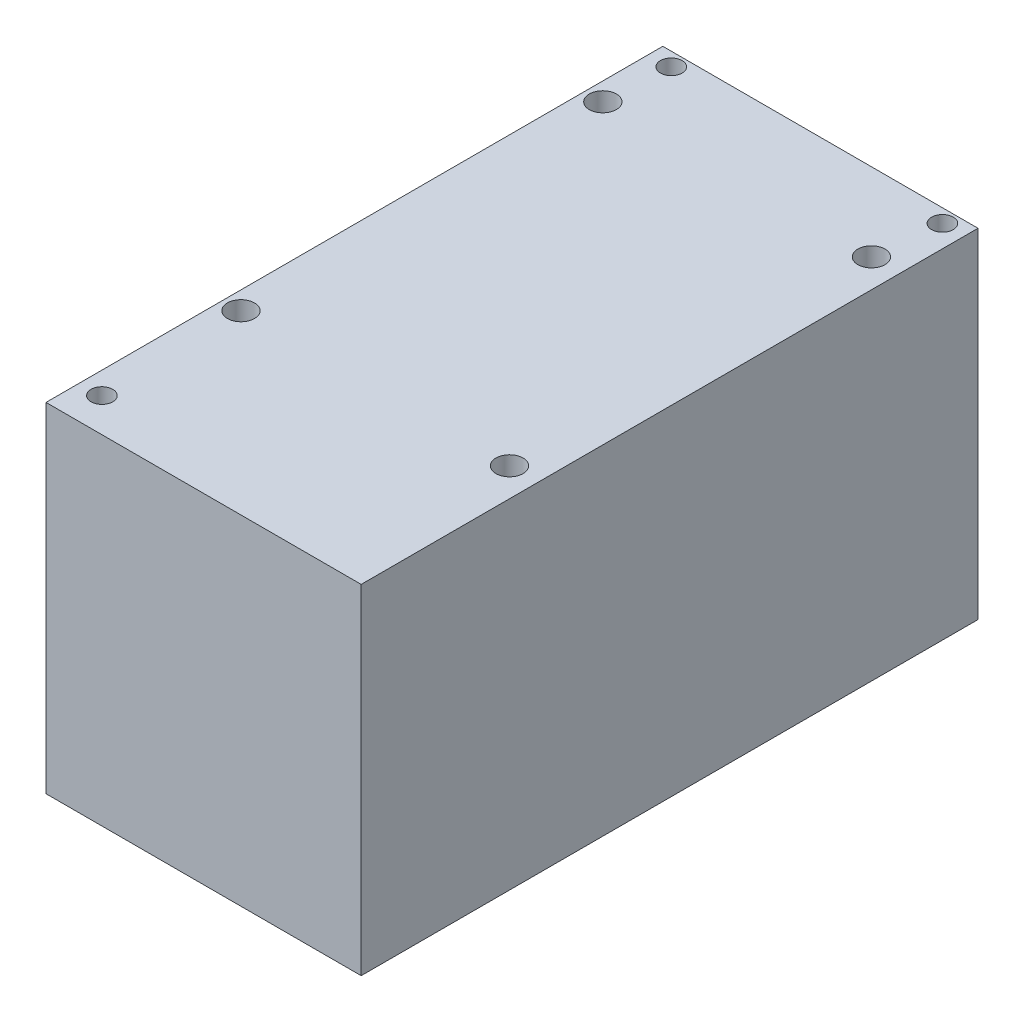
ISO-10303-21;
HEADER;
FILE_DESCRIPTION(('STEP AP214'),'2;1');
FILE_NAME('part.step','',(''),(''),'','','');
FILE_SCHEMA(('AUTOMOTIVE_DESIGN { 1 0 10303 214 1 1 1 1 }'));
ENDSEC;
DATA;
#1=APPLICATION_CONTEXT('core data for automotive mechanical design processes');
#2=APPLICATION_PROTOCOL_DEFINITION('international standard','automotive_design',2000,#1);
#3=PRODUCT_CONTEXT('',#1,'mechanical');
#4=PRODUCT('Part','Part','',(#3));
#5=PRODUCT_RELATED_PRODUCT_CATEGORY('part','',(#4));
#6=PRODUCT_DEFINITION_FORMATION('','',#4);
#7=PRODUCT_DEFINITION_CONTEXT('part definition',#1,'design');
#8=PRODUCT_DEFINITION('design','',#6,#7);
#9=PRODUCT_DEFINITION_SHAPE('','',#8);
#10=(LENGTH_UNIT() NAMED_UNIT(*) SI_UNIT(.MILLI.,.METRE.));
#11=(NAMED_UNIT(*) PLANE_ANGLE_UNIT() SI_UNIT($,.RADIAN.));
#12=(NAMED_UNIT(*) SI_UNIT($,.STERADIAN.) SOLID_ANGLE_UNIT());
#13=UNCERTAINTY_MEASURE_WITH_UNIT(LENGTH_MEASURE(1.E-05),#10,'distance_accuracy_value','');
#14=(GEOMETRIC_REPRESENTATION_CONTEXT(3) GLOBAL_UNCERTAINTY_ASSIGNED_CONTEXT((#13)) GLOBAL_UNIT_ASSIGNED_CONTEXT((#10,
#11,#12)) REPRESENTATION_CONTEXT('',''));
#15=CARTESIAN_POINT('',(0.,0.,0.));
#16=DIRECTION('',(0.,0.,1.));
#17=DIRECTION('',(1.,0.,0.));
#18=AXIS2_PLACEMENT_3D('',#15,#16,#17);
#19=CARTESIAN_POINT('',(0.,50.,0.));
#20=DIRECTION('',(0.,-1.,0.));
#21=DIRECTION('',(0.,0.,-1.));
#22=AXIS2_PLACEMENT_3D('',#19,#20,#21);
#23=PLANE('',#22);
#24=CARTESIAN_POINT('',(19.042,50.,-33.984));
#25=DIRECTION('',(0.,1.,0.));
#26=DIRECTION('',(0.,0.,1.));
#27=AXIS2_PLACEMENT_3D('',#24,#25,#26);
#28=CIRCLE('',#27,2.00000000000002);
#29=CARTESIAN_POINT('',(19.042,50.,-31.984));
#30=VERTEX_POINT('',#29);
#31=EDGE_CURVE('E133',#30,#30,#28,.T.);
#32=ORIENTED_EDGE('',*,*,#31,.F.);
#33=EDGE_LOOP('',(#32));
#34=FACE_BOUND('',#33,.T.);
#35=CARTESIAN_POINT('',(-20.583,50.,-33.984));
#36=DIRECTION('',(0.,1.,0.));
#37=DIRECTION('',(0.,0.,1.));
#38=AXIS2_PLACEMENT_3D('',#35,#36,#37);
#39=CIRCLE('',#38,2.00000000000002);
#40=CARTESIAN_POINT('',(-20.583,50.,-31.984));
#41=VERTEX_POINT('',#40);
#42=EDGE_CURVE('E122',#41,#41,#39,.T.);
#43=ORIENTED_EDGE('',*,*,#42,.F.);
#44=EDGE_LOOP('',(#43));
#45=FACE_BOUND('',#44,.T.);
#46=CARTESIAN_POINT('',(-20.583,50.,19.406));
#47=DIRECTION('',(0.,1.,0.));
#48=DIRECTION('',(0.,0.,1.));
#49=AXIS2_PLACEMENT_3D('',#46,#47,#48);
#50=CIRCLE('',#49,2.00000000000002);
#51=CARTESIAN_POINT('',(-20.583,50.,21.406));
#52=VERTEX_POINT('',#51);
#53=EDGE_CURVE('E121',#52,#52,#50,.T.);
#54=ORIENTED_EDGE('',*,*,#53,.F.);
#55=EDGE_LOOP('',(#54));
#56=FACE_BOUND('',#55,.T.);
#57=CARTESIAN_POINT('',(19.042,50.,19.406));
#58=DIRECTION('',(0.,1.,0.));
#59=DIRECTION('',(0.,0.,1.));
#60=AXIS2_PLACEMENT_3D('',#57,#58,#59);
#61=CIRCLE('',#60,2.00000000000001);
#62=CARTESIAN_POINT('',(19.042,50.,21.406));
#63=VERTEX_POINT('',#62);
#64=EDGE_CURVE('E138',#63,#63,#61,.T.);
#65=ORIENTED_EDGE('',*,*,#64,.F.);
#66=EDGE_LOOP('',(#65));
#67=FACE_BOUND('',#66,.T.);
#68=DIRECTION('',(0.,0.,-1.));
#69=VECTOR('',#68,1.);
#70=CARTESIAN_POINT('',(23.25,50.,45.5));
#71=LINE('',#70,#69);
#72=CARTESIAN_POINT('',(23.25,50.,45.5));
#73=VERTEX_POINT('',#72);
#74=CARTESIAN_POINT('',(23.25,50.,-45.5));
#75=VERTEX_POINT('',#74);
#76=EDGE_CURVE('E98',#73,#75,#71,.T.);
#77=ORIENTED_EDGE('',*,*,#76,.T.);
#78=DIRECTION('',(-1.,0.,0.));
#79=VECTOR('',#78,1.);
#80=CARTESIAN_POINT('',(-23.25,50.,-45.5));
#81=LINE('',#80,#79);
#82=CARTESIAN_POINT('',(-23.25,50.,-45.5));
#83=VERTEX_POINT('',#82);
#84=EDGE_CURVE('E93',#75,#83,#81,.T.);
#85=ORIENTED_EDGE('',*,*,#84,.T.);
#86=DIRECTION('',(0.,0.,1.));
#87=VECTOR('',#86,1.);
#88=CARTESIAN_POINT('',(-23.25,50.,45.5));
#89=LINE('',#88,#87);
#90=CARTESIAN_POINT('',(-23.25,50.,45.5));
#91=VERTEX_POINT('',#90);
#92=EDGE_CURVE('E96',#83,#91,#89,.T.);
#93=ORIENTED_EDGE('',*,*,#92,.T.);
#94=DIRECTION('',(1.,0.,0.));
#95=VECTOR('',#94,1.);
#96=CARTESIAN_POINT('',(-23.25,50.,45.5));
#97=LINE('',#96,#95);
#98=EDGE_CURVE('E63',#91,#73,#97,.T.);
#99=ORIENTED_EDGE('',*,*,#98,.T.);
#100=EDGE_LOOP('',(#77,#85,#93,#99));
#101=FACE_BOUND('',#100,.T.);
#102=CARTESIAN_POINT('',(20.,50.,-43.5));
#103=DIRECTION('',(0.,1.,0.));
#104=DIRECTION('',(0.,0.,1.));
#105=AXIS2_PLACEMENT_3D('',#102,#103,#104);
#106=CIRCLE('',#105,1.6);
#107=CARTESIAN_POINT('',(20.,50.,-41.9));
#108=VERTEX_POINT('',#107);
#109=EDGE_CURVE('E114',#108,#108,#106,.T.);
#110=ORIENTED_EDGE('',*,*,#109,.F.);
#111=EDGE_LOOP('',(#110));
#112=FACE_BOUND('',#111,.T.);
#113=CARTESIAN_POINT('',(-20.,50.,-43.5));
#114=DIRECTION('',(0.,1.,0.));
#115=DIRECTION('',(0.,0.,-1.));
#116=AXIS2_PLACEMENT_3D('',#113,#114,#115);
#117=CIRCLE('',#116,1.6);
#118=CARTESIAN_POINT('',(-20.,50.,-45.1));
#119=VERTEX_POINT('',#118);
#120=EDGE_CURVE('E151',#119,#119,#117,.T.);
#121=ORIENTED_EDGE('',*,*,#120,.F.);
#122=EDGE_LOOP('',(#121));
#123=FACE_BOUND('',#122,.T.);
#124=CARTESIAN_POINT('',(-20.,50.,40.5));
#125=DIRECTION('',(0.,1.,0.));
#126=DIRECTION('',(0.,0.,1.));
#127=AXIS2_PLACEMENT_3D('',#124,#125,#126);
#128=CIRCLE('',#127,1.6);
#129=CARTESIAN_POINT('',(-20.,50.,42.1));
#130=VERTEX_POINT('',#129);
#131=EDGE_CURVE('E145',#130,#130,#128,.T.);
#132=ORIENTED_EDGE('',*,*,#131,.F.);
#133=EDGE_LOOP('',(#132));
#134=FACE_BOUND('',#133,.T.);
#135=ADVANCED_FACE('F44',(#34,#45,#56,#67,#101,#112,#123,#134),#23,.F.);
#136=CARTESIAN_POINT('',(0.,0.,0.));
#137=DIRECTION('',(0.,-1.,0.));
#138=DIRECTION('',(0.,0.,-1.));
#139=AXIS2_PLACEMENT_3D('',#136,#137,#138);
#140=PLANE('',#139);
#141=CARTESIAN_POINT('',(19.042,0.,-33.984));
#142=DIRECTION('',(0.,-1.,0.));
#143=DIRECTION('',(0.,0.,-1.));
#144=AXIS2_PLACEMENT_3D('',#141,#142,#143);
#145=CIRCLE('',#144,2.00000000000001);
#146=CARTESIAN_POINT('',(19.042,0.,-35.984));
#147=VERTEX_POINT('',#146);
#148=EDGE_CURVE('E48',#147,#147,#145,.T.);
#149=ORIENTED_EDGE('',*,*,#148,.F.);
#150=EDGE_LOOP('',(#149));
#151=FACE_BOUND('',#150,.T.);
#152=CARTESIAN_POINT('',(-20.583,0.,-33.984));
#153=DIRECTION('',(0.,-1.,0.));
#154=DIRECTION('',(0.,0.,-1.));
#155=AXIS2_PLACEMENT_3D('',#152,#153,#154);
#156=CIRCLE('',#155,2.00000000000001);
#157=CARTESIAN_POINT('',(-20.583,0.,-35.984));
#158=VERTEX_POINT('',#157);
#159=EDGE_CURVE('E119',#158,#158,#156,.T.);
#160=ORIENTED_EDGE('',*,*,#159,.F.);
#161=EDGE_LOOP('',(#160));
#162=FACE_BOUND('',#161,.T.);
#163=CARTESIAN_POINT('',(-20.583,0.,19.406));
#164=DIRECTION('',(0.,-1.,0.));
#165=DIRECTION('',(0.,0.,-1.));
#166=AXIS2_PLACEMENT_3D('',#163,#164,#165);
#167=CIRCLE('',#166,2.00000000000001);
#168=CARTESIAN_POINT('',(-20.583,0.,17.406));
#169=VERTEX_POINT('',#168);
#170=EDGE_CURVE('E126',#169,#169,#167,.T.);
#171=ORIENTED_EDGE('',*,*,#170,.F.);
#172=EDGE_LOOP('',(#171));
#173=FACE_BOUND('',#172,.T.);
#174=CARTESIAN_POINT('',(19.042,0.,19.406));
#175=DIRECTION('',(0.,1.,0.));
#176=DIRECTION('',(0.,0.,1.));
#177=AXIS2_PLACEMENT_3D('',#174,#175,#176);
#178=CIRCLE('',#177,2.00000000000001);
#179=CARTESIAN_POINT('',(19.042,0.,21.406));
#180=VERTEX_POINT('',#179);
#181=EDGE_CURVE('E141',#180,#180,#178,.T.);
#182=ORIENTED_EDGE('',*,*,#181,.T.);
#183=EDGE_LOOP('',(#182));
#184=FACE_BOUND('',#183,.T.);
#185=CARTESIAN_POINT('',(-20.,0.,-43.5));
#186=DIRECTION('',(0.,1.,0.));
#187=DIRECTION('',(0.,0.,-1.));
#188=AXIS2_PLACEMENT_3D('',#185,#186,#187);
#189=CIRCLE('',#188,1.6);
#190=CARTESIAN_POINT('',(-20.,0.,-45.1));
#191=VERTEX_POINT('',#190);
#192=EDGE_CURVE('E148',#191,#191,#189,.T.);
#193=ORIENTED_EDGE('',*,*,#192,.T.);
#194=EDGE_LOOP('',(#193));
#195=FACE_BOUND('',#194,.T.);
#196=DIRECTION('',(0.,0.,-1.));
#197=VECTOR('',#196,1.);
#198=CARTESIAN_POINT('',(23.25,0.,45.5));
#199=LINE('',#198,#197);
#200=CARTESIAN_POINT('',(23.25,0.,45.5));
#201=VERTEX_POINT('',#200);
#202=CARTESIAN_POINT('',(23.25,0.,-45.5));
#203=VERTEX_POINT('',#202);
#204=EDGE_CURVE('E111',#201,#203,#199,.T.);
#205=ORIENTED_EDGE('',*,*,#204,.F.);
#206=DIRECTION('',(1.,0.,0.));
#207=VECTOR('',#206,1.);
#208=CARTESIAN_POINT('',(-23.25,0.,45.5));
#209=LINE('',#208,#207);
#210=CARTESIAN_POINT('',(-23.25,0.,45.5));
#211=VERTEX_POINT('',#210);
#212=EDGE_CURVE('E86',#211,#201,#209,.T.);
#213=ORIENTED_EDGE('',*,*,#212,.F.);
#214=DIRECTION('',(0.,0.,1.));
#215=VECTOR('',#214,1.);
#216=CARTESIAN_POINT('',(-23.25,0.,45.5));
#217=LINE('',#216,#215);
#218=CARTESIAN_POINT('',(-23.25,0.,-45.5));
#219=VERTEX_POINT('',#218);
#220=EDGE_CURVE('E80',#219,#211,#217,.T.);
#221=ORIENTED_EDGE('',*,*,#220,.F.);
#222=DIRECTION('',(-1.,0.,0.));
#223=VECTOR('',#222,1.);
#224=CARTESIAN_POINT('',(-23.25,0.,-45.5));
#225=LINE('',#224,#223);
#226=EDGE_CURVE('E102',#203,#219,#225,.T.);
#227=ORIENTED_EDGE('',*,*,#226,.F.);
#228=EDGE_LOOP('',(#205,#213,#221,#227));
#229=FACE_BOUND('',#228,.T.);
#230=CARTESIAN_POINT('',(20.,0.,-43.5));
#231=DIRECTION('',(0.,1.,0.));
#232=DIRECTION('',(0.,0.,1.));
#233=AXIS2_PLACEMENT_3D('',#230,#231,#232);
#234=CIRCLE('',#233,1.6);
#235=CARTESIAN_POINT('',(20.,0.,-41.9));
#236=VERTEX_POINT('',#235);
#237=EDGE_CURVE('E154',#236,#236,#234,.T.);
#238=ORIENTED_EDGE('',*,*,#237,.T.);
#239=EDGE_LOOP('',(#238));
#240=FACE_BOUND('',#239,.T.);
#241=CARTESIAN_POINT('',(-20.,0.,40.5));
#242=DIRECTION('',(0.,1.,0.));
#243=DIRECTION('',(0.,0.,1.));
#244=AXIS2_PLACEMENT_3D('',#241,#242,#243);
#245=CIRCLE('',#244,1.6);
#246=CARTESIAN_POINT('',(-20.,0.,42.1));
#247=VERTEX_POINT('',#246);
#248=EDGE_CURVE('E144',#247,#247,#245,.T.);
#249=ORIENTED_EDGE('',*,*,#248,.T.);
#250=EDGE_LOOP('',(#249));
#251=FACE_BOUND('',#250,.T.);
#252=ADVANCED_FACE('F162',(#151,#162,#173,#184,#195,#229,#240,#251),#140,.T.);
#253=CARTESIAN_POINT('',(23.25,50.,45.5));
#254=DIRECTION('',(-1.,0.,0.));
#255=DIRECTION('',(0.,0.,1.));
#256=AXIS2_PLACEMENT_3D('',#253,#254,#255);
#257=PLANE('',#256);
#258=ORIENTED_EDGE('',*,*,#204,.T.);
#259=DIRECTION('',(0.,-1.,0.));
#260=VECTOR('',#259,1.);
#261=CARTESIAN_POINT('',(23.25,50.,-45.5));
#262=LINE('',#261,#260);
#263=EDGE_CURVE('E11',#75,#203,#262,.T.);
#264=ORIENTED_EDGE('',*,*,#263,.F.);
#265=ORIENTED_EDGE('',*,*,#76,.F.);
#266=DIRECTION('',(0.,-1.,0.));
#267=VECTOR('',#266,1.);
#268=CARTESIAN_POINT('',(23.25,50.,45.5));
#269=LINE('',#268,#267);
#270=EDGE_CURVE('E107',#73,#201,#269,.T.);
#271=ORIENTED_EDGE('',*,*,#270,.T.);
#272=EDGE_LOOP('',(#258,#264,#265,#271));
#273=FACE_BOUND('',#272,.T.);
#274=ADVANCED_FACE('F46',(#273),#257,.F.);
#275=CARTESIAN_POINT('',(-23.25,50.,-45.5));
#276=DIRECTION('',(0.,0.,1.));
#277=DIRECTION('',(1.,0.,0.));
#278=AXIS2_PLACEMENT_3D('',#275,#276,#277);
#279=PLANE('',#278);
#280=ORIENTED_EDGE('',*,*,#226,.T.);
#281=DIRECTION('',(0.,-1.,0.));
#282=VECTOR('',#281,1.);
#283=CARTESIAN_POINT('',(-23.25,50.,-45.5));
#284=LINE('',#283,#282);
#285=EDGE_CURVE('E54',#83,#219,#284,.T.);
#286=ORIENTED_EDGE('',*,*,#285,.F.);
#287=ORIENTED_EDGE('',*,*,#84,.F.);
#288=ORIENTED_EDGE('',*,*,#263,.T.);
#289=EDGE_LOOP('',(#280,#286,#287,#288));
#290=FACE_BOUND('',#289,.T.);
#291=ADVANCED_FACE('F101',(#290),#279,.F.);
#292=CARTESIAN_POINT('',(-23.25,50.,45.5));
#293=DIRECTION('',(1.,0.,0.));
#294=DIRECTION('',(0.,0.,-1.));
#295=AXIS2_PLACEMENT_3D('',#292,#293,#294);
#296=PLANE('',#295);
#297=ORIENTED_EDGE('',*,*,#220,.T.);
#298=DIRECTION('',(0.,-1.,0.));
#299=VECTOR('',#298,1.);
#300=CARTESIAN_POINT('',(-23.25,50.,45.5));
#301=LINE('',#300,#299);
#302=EDGE_CURVE('E103',#91,#211,#301,.T.);
#303=ORIENTED_EDGE('',*,*,#302,.F.);
#304=ORIENTED_EDGE('',*,*,#92,.F.);
#305=ORIENTED_EDGE('',*,*,#285,.T.);
#306=EDGE_LOOP('',(#297,#303,#304,#305));
#307=FACE_BOUND('',#306,.T.);
#308=ADVANCED_FACE('F105',(#307),#296,.F.);
#309=CARTESIAN_POINT('',(-23.25,50.,45.5));
#310=DIRECTION('',(0.,0.,-1.));
#311=DIRECTION('',(-1.,0.,0.));
#312=AXIS2_PLACEMENT_3D('',#309,#310,#311);
#313=PLANE('',#312);
#314=ORIENTED_EDGE('',*,*,#212,.T.);
#315=ORIENTED_EDGE('',*,*,#270,.F.);
#316=ORIENTED_EDGE('',*,*,#98,.F.);
#317=ORIENTED_EDGE('',*,*,#302,.T.);
#318=EDGE_LOOP('',(#314,#315,#316,#317));
#319=FACE_BOUND('',#318,.T.);
#320=ADVANCED_FACE('F168',(#319),#313,.F.);
#321=CARTESIAN_POINT('',(20.,50.,-43.5));
#322=DIRECTION('',(0.,-1.,0.));
#323=DIRECTION('',(0.,0.,-1.));
#324=AXIS2_PLACEMENT_3D('',#321,#322,#323);
#325=CYLINDRICAL_SURFACE('',#324,1.6);
#326=ORIENTED_EDGE('',*,*,#109,.T.);
#327=EDGE_LOOP('',(#326));
#328=FACE_BOUND('',#327,.T.);
#329=ORIENTED_EDGE('',*,*,#237,.F.);
#330=EDGE_LOOP('',(#329));
#331=FACE_BOUND('',#330,.T.);
#332=ADVANCED_FACE('F165',(#328,#331),#325,.F.);
#333=CARTESIAN_POINT('',(-20.,50.,-43.5));
#334=DIRECTION('',(0.,-1.,0.));
#335=DIRECTION('',(0.,0.,-1.));
#336=AXIS2_PLACEMENT_3D('',#333,#334,#335);
#337=CYLINDRICAL_SURFACE('',#336,1.6);
#338=ORIENTED_EDGE('',*,*,#120,.T.);
#339=EDGE_LOOP('',(#338));
#340=FACE_BOUND('',#339,.T.);
#341=ORIENTED_EDGE('',*,*,#192,.F.);
#342=EDGE_LOOP('',(#341));
#343=FACE_BOUND('',#342,.T.);
#344=ADVANCED_FACE('F167',(#340,#343),#337,.F.);
#345=CARTESIAN_POINT('',(-20.,50.,40.5));
#346=DIRECTION('',(0.,-1.,0.));
#347=DIRECTION('',(0.,0.,-1.));
#348=AXIS2_PLACEMENT_3D('',#345,#346,#347);
#349=CYLINDRICAL_SURFACE('',#348,1.6);
#350=ORIENTED_EDGE('',*,*,#131,.T.);
#351=EDGE_LOOP('',(#350));
#352=FACE_BOUND('',#351,.T.);
#353=ORIENTED_EDGE('',*,*,#248,.F.);
#354=EDGE_LOOP('',(#353));
#355=FACE_BOUND('',#354,.T.);
#356=ADVANCED_FACE('F175',(#352,#355),#349,.F.);
#357=CARTESIAN_POINT('',(19.042,50.,19.406));
#358=DIRECTION('',(0.,1.,0.));
#359=DIRECTION('',(0.,0.,1.));
#360=AXIS2_PLACEMENT_3D('',#357,#358,#359);
#361=CYLINDRICAL_SURFACE('',#360,2.00000000000001);
#362=ORIENTED_EDGE('',*,*,#181,.F.);
#363=EDGE_LOOP('',(#362));
#364=FACE_BOUND('',#363,.T.);
#365=ORIENTED_EDGE('',*,*,#64,.T.);
#366=EDGE_LOOP('',(#365));
#367=FACE_BOUND('',#366,.T.);
#368=ADVANCED_FACE('F255',(#364,#367),#361,.F.);
#369=CARTESIAN_POINT('',(-20.583,50.,19.406));
#370=DIRECTION('',(0.,1.,0.));
#371=DIRECTION('',(0.,0.,1.));
#372=AXIS2_PLACEMENT_3D('',#369,#370,#371);
#373=CYLINDRICAL_SURFACE('',#372,2.00000000000001);
#374=ORIENTED_EDGE('',*,*,#170,.T.);
#375=EDGE_LOOP('',(#374));
#376=FACE_BOUND('',#375,.T.);
#377=ORIENTED_EDGE('',*,*,#53,.T.);
#378=EDGE_LOOP('',(#377));
#379=FACE_BOUND('',#378,.T.);
#380=ADVANCED_FACE('F264',(#376,#379),#373,.F.);
#381=CARTESIAN_POINT('',(-20.583,50.,-33.984));
#382=DIRECTION('',(0.,1.,0.));
#383=DIRECTION('',(0.,0.,1.));
#384=AXIS2_PLACEMENT_3D('',#381,#382,#383);
#385=CYLINDRICAL_SURFACE('',#384,2.00000000000001);
#386=ORIENTED_EDGE('',*,*,#159,.T.);
#387=EDGE_LOOP('',(#386));
#388=FACE_BOUND('',#387,.T.);
#389=ORIENTED_EDGE('',*,*,#42,.T.);
#390=EDGE_LOOP('',(#389));
#391=FACE_BOUND('',#390,.T.);
#392=ADVANCED_FACE('F272',(#388,#391),#385,.F.);
#393=CARTESIAN_POINT('',(19.042,50.,-33.984));
#394=DIRECTION('',(0.,1.,0.));
#395=DIRECTION('',(0.,0.,1.));
#396=AXIS2_PLACEMENT_3D('',#393,#394,#395);
#397=CYLINDRICAL_SURFACE('',#396,2.00000000000001);
#398=ORIENTED_EDGE('',*,*,#148,.T.);
#399=EDGE_LOOP('',(#398));
#400=FACE_BOUND('',#399,.T.);
#401=ORIENTED_EDGE('',*,*,#31,.T.);
#402=EDGE_LOOP('',(#401));
#403=FACE_BOUND('',#402,.T.);
#404=ADVANCED_FACE('F281',(#400,#403),#397,.F.);
#405=CLOSED_SHELL('',(#135,#252,#274,#291,#308,#320,#332,#344,#356,#368,#380,#392,#404));
#406=MANIFOLD_SOLID_BREP('B2',#405);
#407=ADVANCED_BREP_SHAPE_REPRESENTATION('',(#18,#406),#14);
#408=SHAPE_DEFINITION_REPRESENTATION(#9,#407);
ENDSEC;
END-ISO-10303-21;
